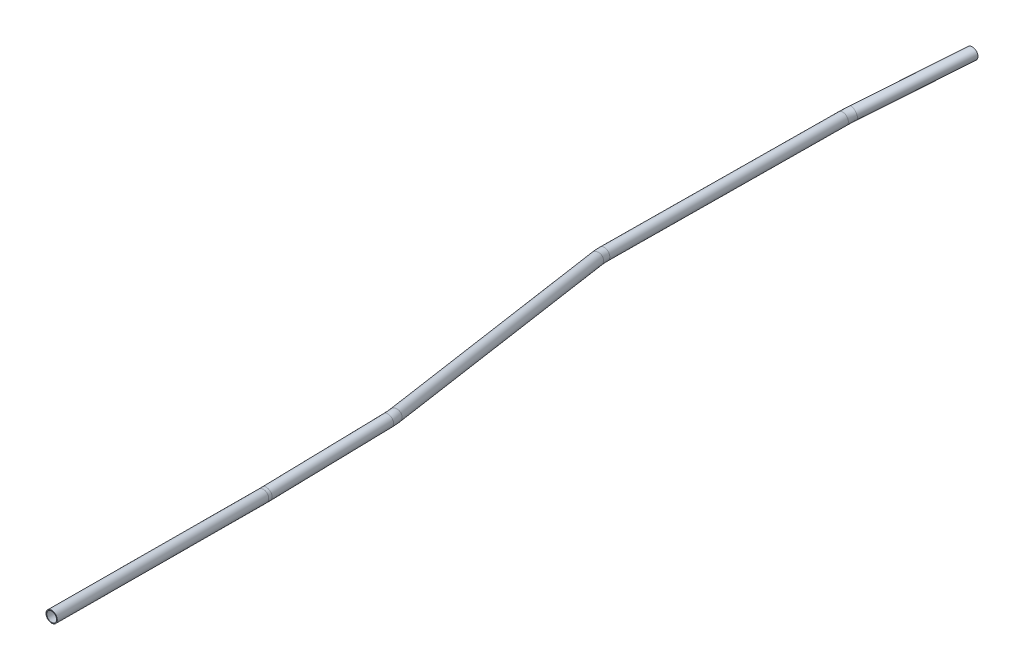
ISO-10303-21;
HEADER;
FILE_DESCRIPTION(('STEP AP214'),'2;1');
FILE_NAME('part.step','',(''),(''),'','','');
FILE_SCHEMA(('AUTOMOTIVE_DESIGN { 1 0 10303 214 1 1 1 1 }'));
ENDSEC;
DATA;
#1=APPLICATION_CONTEXT('core data for automotive mechanical design processes');
#2=APPLICATION_PROTOCOL_DEFINITION('international standard','automotive_design',2000,#1);
#3=PRODUCT_CONTEXT('',#1,'mechanical');
#4=PRODUCT('Part','Part','',(#3));
#5=PRODUCT_RELATED_PRODUCT_CATEGORY('part','',(#4));
#6=PRODUCT_DEFINITION_FORMATION('','',#4);
#7=PRODUCT_DEFINITION_CONTEXT('part definition',#1,'design');
#8=PRODUCT_DEFINITION('design','',#6,#7);
#9=PRODUCT_DEFINITION_SHAPE('','',#8);
#10=(LENGTH_UNIT() NAMED_UNIT(*) SI_UNIT(.MILLI.,.METRE.));
#11=(NAMED_UNIT(*) PLANE_ANGLE_UNIT() SI_UNIT($,.RADIAN.));
#12=(NAMED_UNIT(*) SI_UNIT($,.STERADIAN.) SOLID_ANGLE_UNIT());
#13=UNCERTAINTY_MEASURE_WITH_UNIT(LENGTH_MEASURE(1.E-05),#10,'distance_accuracy_value','');
#14=(GEOMETRIC_REPRESENTATION_CONTEXT(3) GLOBAL_UNCERTAINTY_ASSIGNED_CONTEXT((#13)) GLOBAL_UNIT_ASSIGNED_CONTEXT((#10,
#11,#12)) REPRESENTATION_CONTEXT('',''));
#15=CARTESIAN_POINT('',(0.,0.,0.));
#16=DIRECTION('',(0.,0.,1.));
#17=DIRECTION('',(1.,0.,0.));
#18=AXIS2_PLACEMENT_3D('',#15,#16,#17);
#19=CARTESIAN_POINT('',(-200.097461671091,113.749121177859,920.697327819594));
#20=DIRECTION('',(0.0609693238726773,0.0650491189961432,0.996017747665338));
#21=DIRECTION('',(0.,-0.997874152520213,0.0651703593059598));
#22=AXIS2_PLACEMENT_3D('',#19,#20,#21);
#23=CYLINDRICAL_SURFACE('',#22,11.049);
#24=CARTESIAN_POINT('',(-169.052406241001,146.871573201946,1427.861));
#25=DIRECTION('',(0.,0.,1.));
#26=DIRECTION('',(0.683856204975952,0.729616811015132,0.));
#27=AXIS2_PLACEMENT_3D('',#24,#25,#26);
#28=ELLIPSE('',#27,11.0931758253292,11.049);
#29=CARTESIAN_POINT('',(-161.466269119961,154.965340771653,1427.861));
#30=VERTEX_POINT('',#29);
#31=EDGE_CURVE('E47',#30,#30,#28,.T.);
#32=ORIENTED_EDGE('',*,*,#31,.T.);
#33=EDGE_LOOP('',(#32));
#34=FACE_BOUND('',#33,.T.);
#35=CARTESIAN_POINT('',(-200.097461671091,113.749121177859,920.697327819595));
#36=DIRECTION('',(0.0609693238726772,0.0650491189961432,0.996017747665339));
#37=DIRECTION('',(0.,-0.997874152520213,0.0651703593059598));
#38=AXIS2_PLACEMENT_3D('',#35,#36,#37);
#39=CIRCLE('',#38,11.049);
#40=CARTESIAN_POINT('',(-206.384831826603,104.715899165072,921.67214964704));
#41=VERTEX_POINT('',#40);
#42=EDGE_CURVE('E60',#41,#41,#39,.T.);
#43=ORIENTED_EDGE('',*,*,#42,.F.);
#44=EDGE_LOOP('',(#43));
#45=FACE_BOUND('',#44,.T.);
#46=ADVANCED_FACE('F43',(#34,#45),#23,.F.);
#47=CARTESIAN_POINT('',(-200.097461671091,113.749121177859,920.697327819594));
#48=DIRECTION('',(0.0609693238726773,0.0650491189961432,0.996017747665338));
#49=DIRECTION('',(0.,-0.997874152520213,0.0651703593059598));
#50=AXIS2_PLACEMENT_3D('',#47,#48,#49);
#51=CYLINDRICAL_SURFACE('',#50,12.7);
#52=CARTESIAN_POINT('',(-169.052406241001,146.871573201946,1427.861));
#53=DIRECTION('',(0.,0.,1.));
#54=DIRECTION('',(0.683856204975952,0.729616811015132,0.));
#55=AXIS2_PLACEMENT_3D('',#52,#53,#54);
#56=ELLIPSE('',#55,12.7507768107232,12.7);
#57=CARTESIAN_POINT('',(-160.332708400725,156.174754316552,1427.861));
#58=VERTEX_POINT('',#57);
#59=EDGE_CURVE('E52',#58,#58,#56,.T.);
#60=ORIENTED_EDGE('',*,*,#59,.F.);
#61=EDGE_LOOP('',(#60));
#62=FACE_BOUND('',#61,.T.);
#63=CARTESIAN_POINT('',(-200.097461671091,113.749121177859,920.697327819595));
#64=DIRECTION('',(-0.0609693238726772,-0.0650491189961432,-0.996017747665339));
#65=DIRECTION('',(0.,0.997874152520213,-0.0651703593059598));
#66=AXIS2_PLACEMENT_3D('',#63,#64,#65);
#67=CIRCLE('',#66,12.7);
#68=CARTESIAN_POINT('',(-207.324323918806,103.366107370057,921.817812678727));
#69=VERTEX_POINT('',#68);
#70=EDGE_CURVE('E10',#69,#69,#67,.T.);
#71=ORIENTED_EDGE('',*,*,#70,.F.);
#72=EDGE_LOOP('',(#71));
#73=FACE_BOUND('',#72,.T.);
#74=ADVANCED_FACE('F45',(#62,#73),#51,.T.);
#75=CARTESIAN_POINT('',(-171.45,131.826,1427.861));
#76=DIRECTION('',(0.,0.,1.));
#77=DIRECTION('',(1.,0.,0.));
#78=AXIS2_PLACEMENT_3D('',#75,#76,#77);
#79=PLANE('',#78);
#80=ORIENTED_EDGE('',*,*,#31,.F.);
#81=EDGE_LOOP('',(#80));
#82=FACE_BOUND('',#81,.T.);
#83=ORIENTED_EDGE('',*,*,#59,.T.);
#84=EDGE_LOOP('',(#83));
#85=FACE_BOUND('',#84,.T.);
#86=ADVANCED_FACE('F172',(#82,#85),#79,.T.);
#87=CARTESIAN_POINT('',(-155.579990225167,177.708486233918,913.795141087337));
#88=DIRECTION('',(0.820043510217331,-0.572157343537613,-0.0128302605749608));
#89=DIRECTION('',(0.572204442360909,0.820111014523303,0.));
#90=AXIS2_PLACEMENT_3D('',#87,#88,#89);
#91=TOROIDAL_SURFACE('',#90,78.2319999999991,11.049);
#92=CARTESIAN_POINT('',(-200.35188799348,113.578606447987,912.039717245192));
#93=DIRECTION('',(-0.00232098852145129,-0.0257434175814918,0.999665888916647));
#94=DIRECTION('',(0.,-0.999668581521458,-0.025743486921509));
#95=AXIS2_PLACEMENT_3D('',#92,#93,#94);
#96=CIRCLE('',#95,11.049);
#97=CARTESIAN_POINT('',(-206.675191736732,104.521301997701,911.79179212463));
#98=VERTEX_POINT('',#97);
#99=EDGE_CURVE('E65',#98,#98,#96,.T.);
#100=CARTESIAN_POINT('',(-155.579990225167,177.708486233918,913.795141087337));
#101=DIRECTION('',(0.820043510217331,-0.572157343537613,-0.0128302605749608));
#102=DIRECTION('',(0.572204442360909,0.820111014523303,0.));
#103=AXIS2_PLACEMENT_3D('',#100,#101,#102);
#104=CIRCLE('',#103,89.2809999999991);
#105=EDGE_CURVE('',#41,#98,#104,.T.);
#106=ORIENTED_EDGE('',*,*,#42,.T.);
#107=ORIENTED_EDGE('',*,*,#99,.F.);
#108=ORIENTED_EDGE('',*,*,#105,.T.);
#109=ORIENTED_EDGE('',*,*,#105,.F.);
#110=EDGE_LOOP('',(#106,#108,#107,#109));
#111=FACE_BOUND('',#110,.T.);
#112=ADVANCED_FACE('F169',(#111),#91,.F.);
#113=CARTESIAN_POINT('',(-155.579990225167,177.708486233918,913.795141087337));
#114=DIRECTION('',(0.820043510217331,-0.572157343537613,-0.0128302605749608));
#115=DIRECTION('',(0.572204442360909,0.820111014523303,0.));
#116=AXIS2_PLACEMENT_3D('',#113,#114,#115);
#117=TOROIDAL_SURFACE('',#116,78.2319999999991,12.7);
#118=CARTESIAN_POINT('',(-200.35188799348,113.578606447987,912.039717245192));
#119=DIRECTION('',(-0.00232098852145129,-0.0257434175814918,0.999665888916647));
#120=DIRECTION('',(0.,-0.999668581521458,-0.025743486921509));
#121=AXIS2_PLACEMENT_3D('',#118,#119,#120);
#122=CIRCLE('',#121,12.7);
#123=CARTESIAN_POINT('',(-207.620053215609,103.167911677544,911.754745842247));
#124=VERTEX_POINT('',#123);
#125=EDGE_CURVE('E64',#124,#124,#122,.T.);
#126=CARTESIAN_POINT('',(-155.579990225167,177.708486233918,913.795141087337));
#127=DIRECTION('',(0.820043510217331,-0.572157343537613,-0.0128302605749608));
#128=DIRECTION('',(0.572204442360909,0.820111014523303,0.));
#129=AXIS2_PLACEMENT_3D('',#126,#127,#128);
#130=CIRCLE('',#129,90.9319999999991);
#131=EDGE_CURVE('',#69,#124,#130,.T.);
#132=ORIENTED_EDGE('',*,*,#70,.T.);
#133=ORIENTED_EDGE('',*,*,#125,.T.);
#134=ORIENTED_EDGE('',*,*,#131,.T.);
#135=ORIENTED_EDGE('',*,*,#131,.F.);
#136=EDGE_LOOP('',(#132,#134,#133,#135));
#137=FACE_BOUND('',#136,.T.);
#138=ADVANCED_FACE('F165',(#137),#117,.T.);
#139=CARTESIAN_POINT('',(-199.717136613251,120.618998802645,638.64788575035));
#140=DIRECTION('',(-0.00232098852145166,-0.0257434175814926,0.999665888916647));
#141=DIRECTION('',(0.,-0.999668581521458,-0.0257434869215099));
#142=AXIS2_PLACEMENT_3D('',#139,#140,#141);
#143=CYLINDRICAL_SURFACE('',#142,11.049);
#144=CARTESIAN_POINT('',(-199.717136613251,120.618998802645,638.64788575035));
#145=DIRECTION('',(-0.00232098852145129,-0.0257434175814918,0.999665888916647));
#146=DIRECTION('',(0.,-0.999668581521458,-0.025743486921509));
#147=AXIS2_PLACEMENT_3D('',#144,#145,#146);
#148=CIRCLE('',#147,11.049);
#149=CARTESIAN_POINT('',(-189.809360472075,125.507168864739,638.796769531886));
#150=VERTEX_POINT('',#149);
#151=EDGE_CURVE('E88',#150,#150,#148,.T.);
#152=ORIENTED_EDGE('',*,*,#151,.F.);
#153=EDGE_LOOP('',(#152));
#154=FACE_BOUND('',#153,.T.);
#155=ORIENTED_EDGE('',*,*,#99,.T.);
#156=EDGE_LOOP('',(#155));
#157=FACE_BOUND('',#156,.T.);
#158=ADVANCED_FACE('F162',(#154,#157),#143,.F.);
#159=CARTESIAN_POINT('',(-199.717136613251,120.618998802645,638.64788575035));
#160=DIRECTION('',(-0.00232098852145166,-0.0257434175814926,0.999665888916647));
#161=DIRECTION('',(0.,-0.999668581521458,-0.0257434869215099));
#162=AXIS2_PLACEMENT_3D('',#159,#160,#161);
#163=CYLINDRICAL_SURFACE('',#162,12.7);
#164=CARTESIAN_POINT('',(-199.717136613251,120.618998802645,638.64788575035));
#165=DIRECTION('',(0.00232098852145129,0.0257434175814918,-0.999665888916647));
#166=DIRECTION('',(0.,0.999668581521458,0.025743486921509));
#167=AXIS2_PLACEMENT_3D('',#164,#165,#166);
#168=CIRCLE('',#167,12.7);
#169=CARTESIAN_POINT('',(-188.328888175118,126.237585080914,638.819016533725));
#170=VERTEX_POINT('',#169);
#171=EDGE_CURVE('E69',#170,#170,#168,.T.);
#172=ORIENTED_EDGE('',*,*,#171,.F.);
#173=EDGE_LOOP('',(#172));
#174=FACE_BOUND('',#173,.T.);
#175=ORIENTED_EDGE('',*,*,#125,.F.);
#176=EDGE_LOOP('',(#175));
#177=FACE_BOUND('',#176,.T.);
#178=ADVANCED_FACE('F152',(#174,#177),#163,.T.);
#179=CARTESIAN_POINT('',(-328.732320897393,71.6879890705573,38.4396950604482));
#180=DIRECTION('',(0.21271454878928,0.0810653161140893,0.973745826823764));
#181=DIRECTION('',(0.976961210122473,0.,-0.213416948521046));
#182=AXIS2_PLACEMENT_3D('',#179,#180,#181);
#183=CYLINDRICAL_SURFACE('',#182,11.049);
#184=CARTESIAN_POINT('',(-328.732320897386,71.6879890705599,38.4396950604789));
#185=DIRECTION('',(0.212714548789278,0.0810653161140891,0.973745826823765));
#186=DIRECTION('',(0.976961210122474,0.,-0.213416948521044));
#187=AXIS2_PLACEMENT_3D('',#184,#185,#186);
#188=CIRCLE('',#187,11.049);
#189=CARTESIAN_POINT('',(-338.842563257646,68.0084958401719,40.9545966458976));
#190=VERTEX_POINT('',#189);
#191=EDGE_CURVE('E92',#190,#190,#188,.T.);
#192=ORIENTED_EDGE('',*,*,#191,.F.);
#193=EDGE_LOOP('',(#192));
#194=FACE_BOUND('',#193,.T.);
#195=CARTESIAN_POINT('',(-201.719236998212,120.092556861133,619.868944271621));
#196=DIRECTION('',(-0.212714548789278,-0.0810653161140893,-0.973745826823764));
#197=DIRECTION('',(-0.976961210122473,0.,0.213416948521044));
#198=AXIS2_PLACEMENT_3D('',#195,#196,#197);
#199=CIRCLE('',#198,11.049);
#200=CARTESIAN_POINT('',(-192.094225034783,124.906375545124,617.365607422233));
#201=VERTEX_POINT('',#200);
#202=EDGE_CURVE('E84',#201,#201,#199,.T.);
#203=ORIENTED_EDGE('',*,*,#202,.F.);
#204=EDGE_LOOP('',(#203));
#205=FACE_BOUND('',#204,.T.);
#206=ADVANCED_FACE('F148',(#194,#205),#183,.F.);
#207=CARTESIAN_POINT('',(-328.732320897393,71.6879890705573,38.4396950604482));
#208=DIRECTION('',(0.21271454878928,0.0810653161140893,0.973745826823764));
#209=DIRECTION('',(0.976961210122473,0.,-0.213416948521046));
#210=AXIS2_PLACEMENT_3D('',#207,#208,#209);
#211=CYLINDRICAL_SURFACE('',#210,12.7);
#212=CARTESIAN_POINT('',(-328.732320897393,71.6879890705574,38.4396950604495));
#213=DIRECTION('',(-0.212714548789278,-0.0810653161140891,-0.973745826823765));
#214=DIRECTION('',(-0.976961210122474,0.,0.213416948521044));
#215=AXIS2_PLACEMENT_3D('',#212,#213,#214);
#216=CIRCLE('',#215,12.7);
#217=CARTESIAN_POINT('',(-340.353289127577,67.4586865068927,41.3303865379374));
#218=VERTEX_POINT('',#217);
#219=EDGE_CURVE('E80',#218,#218,#216,.T.);
#220=ORIENTED_EDGE('',*,*,#219,.F.);
#221=EDGE_LOOP('',(#220));
#222=FACE_BOUND('',#221,.T.);
#223=CARTESIAN_POINT('',(-201.719236998212,120.092556861133,619.868944271622));
#224=DIRECTION('',(0.212714548789278,0.0810653161140891,0.973745826823765));
#225=DIRECTION('',(0.976961210122474,0.,-0.213416948521044));
#226=AXIS2_PLACEMENT_3D('',#223,#224,#225);
#227=CIRCLE('',#226,12.7);
#228=CARTESIAN_POINT('',(-190.656004856339,125.625681785261,616.991545594164));
#229=VERTEX_POINT('',#228);
#230=EDGE_CURVE('E70',#229,#229,#227,.T.);
#231=ORIENTED_EDGE('',*,*,#230,.F.);
#232=EDGE_LOOP('',(#231));
#233=FACE_BOUND('',#232,.T.);
#234=ADVANCED_FACE('F151',(#222,#233),#211,.T.);
#235=CARTESIAN_POINT('',(-269.868746992148,86.0085073285092,637.593720124761));
#236=DIRECTION('',(-0.44260744390062,0.896444148873496,0.0220576189611005));
#237=DIRECTION('',(-0.896662305803114,-0.442715155999705,0.));
#238=AXIS2_PLACEMENT_3D('',#235,#236,#237);
#239=TOROIDAL_SURFACE('',#238,78.2320000000001,11.049);
#240=CARTESIAN_POINT('',(-269.868746992148,86.0085073285092,637.593720124761));
#241=DIRECTION('',(-0.44260744390062,0.896444148873496,0.0220576189611005));
#242=DIRECTION('',(-0.896662305803114,-0.442715155999705,0.));
#243=AXIS2_PLACEMENT_3D('',#240,#241,#242);
#244=CIRCLE('',#243,89.2810000000001);
#245=EDGE_CURVE('',#150,#201,#244,.T.);
#246=ORIENTED_EDGE('',*,*,#151,.T.);
#247=ORIENTED_EDGE('',*,*,#202,.T.);
#248=ORIENTED_EDGE('',*,*,#245,.T.);
#249=ORIENTED_EDGE('',*,*,#245,.F.);
#250=EDGE_LOOP('',(#246,#248,#247,#249));
#251=FACE_BOUND('',#250,.T.);
#252=ADVANCED_FACE('F156',(#251),#239,.F.);
#253=CARTESIAN_POINT('',(-269.868746992148,86.0085073285092,637.593720124761));
#254=DIRECTION('',(-0.44260744390062,0.896444148873496,0.0220576189611005));
#255=DIRECTION('',(-0.896662305803114,-0.442715155999705,0.));
#256=AXIS2_PLACEMENT_3D('',#253,#254,#255);
#257=TOROIDAL_SURFACE('',#256,78.2320000000001,12.7);
#258=CARTESIAN_POINT('',(-269.868746992148,86.0085073285092,637.593720124761));
#259=DIRECTION('',(-0.44260744390062,0.896444148873496,0.0220576189611005));
#260=DIRECTION('',(-0.896662305803114,-0.442715155999705,0.));
#261=AXIS2_PLACEMENT_3D('',#258,#259,#260);
#262=CIRCLE('',#261,90.9320000000001);
#263=EDGE_CURVE('',#170,#229,#262,.T.);
#264=ORIENTED_EDGE('',*,*,#171,.T.);
#265=ORIENTED_EDGE('',*,*,#230,.T.);
#266=ORIENTED_EDGE('',*,*,#263,.T.);
#267=ORIENTED_EDGE('',*,*,#263,.F.);
#268=EDGE_LOOP('',(#264,#266,#265,#267));
#269=FACE_BOUND('',#268,.T.);
#270=ADVANCED_FACE('F144',(#269),#257,.T.);
#271=CARTESIAN_POINT('',(-257.147156599456,97.7404928627321,20.6330355591237));
#272=DIRECTION('',(0.342724451980664,-0.93943003552099,0.00334041548097702));
#273=DIRECTION('',(0.93943527682144,0.342726364120745,0.));
#274=AXIS2_PLACEMENT_3D('',#271,#272,#273);
#275=TOROIDAL_SURFACE('',#274,78.2319999999999,11.049);
#276=CARTESIAN_POINT('',(-330.638019560969,70.9272193840803,20.0107409896593));
#277=DIRECTION('',(-0.00861756932319646,0.000411780998432308,0.999962783275143));
#278=DIRECTION('',(0.999962868053794,0.,0.00861757005380942));
#279=AXIS2_PLACEMENT_3D('',#276,#277,#278);
#280=CIRCLE('',#279,11.049);
#281=CARTESIAN_POINT('',(-341.017410920793,67.1402797856344,19.9228519839071));
#282=VERTEX_POINT('',#281);
#283=EDGE_CURVE('E97',#282,#282,#280,.T.);
#284=CARTESIAN_POINT('',(-257.147156599456,97.7404928627321,20.6330355591237));
#285=DIRECTION('',(0.342724451980664,-0.93943003552099,0.00334041548097702));
#286=DIRECTION('',(0.93943527682144,0.342726364120745,0.));
#287=AXIS2_PLACEMENT_3D('',#284,#285,#286);
#288=CIRCLE('',#287,89.2809999999999);
#289=EDGE_CURVE('',#190,#282,#288,.T.);
#290=ORIENTED_EDGE('',*,*,#191,.T.);
#291=ORIENTED_EDGE('',*,*,#283,.F.);
#292=ORIENTED_EDGE('',*,*,#289,.T.);
#293=ORIENTED_EDGE('',*,*,#289,.F.);
#294=EDGE_LOOP('',(#290,#292,#291,#293));
#295=FACE_BOUND('',#294,.T.);
#296=ADVANCED_FACE('F141',(#295),#275,.F.);
#297=CARTESIAN_POINT('',(-257.147156599456,97.7404928627321,20.6330355591237));
#298=DIRECTION('',(0.342724451980664,-0.93943003552099,0.00334041548097702));
#299=DIRECTION('',(0.93943527682144,0.342726364120745,0.));
#300=AXIS2_PLACEMENT_3D('',#297,#298,#299);
#301=TOROIDAL_SURFACE('',#300,78.2319999999999,12.7);
#302=CARTESIAN_POINT('',(-330.638019560969,70.9272193840803,20.0107409896593));
#303=DIRECTION('',(-0.00861756932319646,0.000411780998432308,0.999962783275143));
#304=DIRECTION('',(0.999962868053794,0.,0.00861757005380942));
#305=AXIS2_PLACEMENT_3D('',#302,#303,#304);
#306=CIRCLE('',#305,12.7);
#307=CARTESIAN_POINT('',(-342.568354457318,66.5744152479355,19.9097191439671));
#308=VERTEX_POINT('',#307);
#309=EDGE_CURVE('E96',#308,#308,#306,.T.);
#310=CARTESIAN_POINT('',(-257.147156599456,97.7404928627321,20.6330355591237));
#311=DIRECTION('',(0.342724451980664,-0.93943003552099,0.00334041548097702));
#312=DIRECTION('',(0.93943527682144,0.342726364120745,0.));
#313=AXIS2_PLACEMENT_3D('',#310,#311,#312);
#314=CIRCLE('',#313,90.9319999999999);
#315=EDGE_CURVE('',#218,#308,#314,.T.);
#316=ORIENTED_EDGE('',*,*,#219,.T.);
#317=ORIENTED_EDGE('',*,*,#309,.T.);
#318=ORIENTED_EDGE('',*,*,#315,.T.);
#319=ORIENTED_EDGE('',*,*,#315,.F.);
#320=EDGE_LOOP('',(#316,#318,#317,#319));
#321=FACE_BOUND('',#320,.T.);
#322=ADVANCED_FACE('F137',(#321),#301,.T.);
#323=CARTESIAN_POINT('',(-326.042536736013,70.7076293309975,-513.238441419259));
#324=DIRECTION('',(-0.0086175693235513,0.000411780998272257,0.999962783275139));
#325=DIRECTION('',(0.999962868053791,0.,0.00861757005416428));
#326=AXIS2_PLACEMENT_3D('',#323,#324,#325);
#327=CYLINDRICAL_SURFACE('',#326,11.049);
#328=CARTESIAN_POINT('',(-326.042536736013,70.7076293309975,-513.238441419228));
#329=DIRECTION('',(-0.00861756932319646,0.000411780998432308,0.999962783275143));
#330=DIRECTION('',(0.999962868053794,0.,0.00861757005380942));
#331=AXIS2_PLACEMENT_3D('',#328,#329,#330);
#332=CIRCLE('',#331,11.049);
#333=CARTESIAN_POINT('',(-335.142372679295,64.4412400228081,-513.314282328804));
#334=VERTEX_POINT('',#333);
#335=EDGE_CURVE('E124',#334,#334,#332,.T.);
#336=ORIENTED_EDGE('',*,*,#335,.F.);
#337=EDGE_LOOP('',(#336));
#338=FACE_BOUND('',#337,.T.);
#339=ORIENTED_EDGE('',*,*,#283,.T.);
#340=EDGE_LOOP('',(#339));
#341=FACE_BOUND('',#340,.T.);
#342=ADVANCED_FACE('F133',(#338,#341),#327,.F.);
#343=CARTESIAN_POINT('',(-326.042536736013,70.7076293309975,-513.238441419259));
#344=DIRECTION('',(-0.0086175693235513,0.000411780998272257,0.999962783275139));
#345=DIRECTION('',(0.999962868053791,0.,0.00861757005416428));
#346=AXIS2_PLACEMENT_3D('',#343,#344,#345);
#347=CYLINDRICAL_SURFACE('',#346,12.7);
#348=CARTESIAN_POINT('',(-326.042536736013,70.7076293309975,-513.238441419258));
#349=DIRECTION('',(0.00861756932319646,-0.000411780998432308,-0.999962783275143));
#350=DIRECTION('',(-0.999962868053794,0.,-0.00861757005380942));
#351=AXIS2_PLACEMENT_3D('',#348,#349,#350);
#352=CIRCLE('',#351,12.7);
#353=CARTESIAN_POINT('',(-336.502118280015,63.5048829997454,-513.325614878545));
#354=VERTEX_POINT('',#353);
#355=EDGE_CURVE('E101',#354,#354,#352,.T.);
#356=ORIENTED_EDGE('',*,*,#355,.F.);
#357=EDGE_LOOP('',(#356));
#358=FACE_BOUND('',#357,.T.);
#359=ORIENTED_EDGE('',*,*,#309,.F.);
#360=EDGE_LOOP('',(#359));
#361=FACE_BOUND('',#360,.T.);
#362=ADVANCED_FACE('F136',(#358,#361),#347,.T.);
#363=CARTESIAN_POINT('',(-268.329604576392,108.860777143036,-763.238321143162));
#364=DIRECTION('',(-0.231419568546329,-0.153252933367984,0.960707302828463));
#365=DIRECTION('',(0.972191808874912,0.,0.234186008882956));
#366=AXIS2_PLACEMENT_3D('',#363,#364,#365);
#367=CYLINDRICAL_SURFACE('',#366,11.049);
#368=CARTESIAN_POINT('',(-271.388838655165,106.834861187111,-750.53832114316));
#369=DIRECTION('',(0.,0.,1.));
#370=DIRECTION('',(-0.833753702996067,-0.5521365435654,0.));
#371=AXIS2_PLACEMENT_3D('',#368,#369,#370);
#372=ELLIPSE('',#371,11.5009014373786,11.049);
#373=CARTESIAN_POINT('',(-280.977757816372,100.484793219591,-750.53832114316));
#374=VERTEX_POINT('',#373);
#375=EDGE_CURVE('E109',#374,#374,#372,.T.);
#376=ORIENTED_EDGE('',*,*,#375,.F.);
#377=EDGE_LOOP('',(#376));
#378=FACE_BOUND('',#377,.T.);
#379=CARTESIAN_POINT('',(-323.450347171268,72.3581790907233,-534.411950577945));
#380=DIRECTION('',(0.231419568545988,0.153252933367833,-0.960707302828569));
#381=DIRECTION('',(-0.972191808874997,0.,-0.234186008882605));
#382=AXIS2_PLACEMENT_3D('',#379,#380,#381);
#383=CIRCLE('',#382,11.049);
#384=CARTESIAN_POINT('',(-332.184078462962,66.3249031138005,-537.478205575621));
#385=VERTEX_POINT('',#384);
#386=EDGE_CURVE('E117',#385,#385,#383,.T.);
#387=ORIENTED_EDGE('',*,*,#386,.F.);
#388=EDGE_LOOP('',(#387));
#389=FACE_BOUND('',#388,.T.);
#390=ADVANCED_FACE('F203',(#378,#389),#367,.F.);
#391=CARTESIAN_POINT('',(-268.329604576392,108.860777143036,-763.238321143162));
#392=DIRECTION('',(-0.231419568546329,-0.153252933367984,0.960707302828463));
#393=DIRECTION('',(0.972191808874912,0.,0.234186008882956));
#394=AXIS2_PLACEMENT_3D('',#391,#392,#393);
#395=CYLINDRICAL_SURFACE('',#394,12.7);
#396=CARTESIAN_POINT('',(-271.388838655165,106.834861187111,-750.53832114316));
#397=DIRECTION('',(0.,0.,1.));
#398=DIRECTION('',(-0.833753702996067,-0.5521365435654,0.));
#399=AXIS2_PLACEMENT_3D('',#396,#397,#398);
#400=ELLIPSE('',#399,13.2194269395156,12.7);
#401=CARTESIAN_POINT('',(-282.410584817472,99.5359324888117,-750.53832114316));
#402=VERTEX_POINT('',#401);
#403=EDGE_CURVE('E113',#402,#402,#400,.T.);
#404=ORIENTED_EDGE('',*,*,#403,.T.);
#405=EDGE_LOOP('',(#404));
#406=FACE_BOUND('',#405,.T.);
#407=CARTESIAN_POINT('',(-323.450347171261,72.3581790907279,-534.411950577974));
#408=DIRECTION('',(-0.231419568545988,-0.153252933367833,0.960707302828569));
#409=DIRECTION('',(0.972191808874997,0.,0.234186008882605));
#410=AXIS2_PLACEMENT_3D('',#407,#408,#409);
#411=CIRCLE('',#410,12.7);
#412=CARTESIAN_POINT('',(-333.489118770908,65.4233791172544,-537.93638160979));
#413=VERTEX_POINT('',#412);
#414=EDGE_CURVE('E102',#413,#413,#411,.T.);
#415=ORIENTED_EDGE('',*,*,#414,.F.);
#416=EDGE_LOOP('',(#415));
#417=FACE_BOUND('',#416,.T.);
#418=ADVANCED_FACE('F206',(#406,#417),#395,.T.);
#419=CARTESIAN_POINT('',(1.11022302462516E-13,0.,-750.538321143161));
#420=DIRECTION('',(0.,0.,1.));
#421=DIRECTION('',(1.,0.,0.));
#422=AXIS2_PLACEMENT_3D('',#419,#420,#421);
#423=PLANE('',#422);
#424=ORIENTED_EDGE('',*,*,#375,.T.);
#425=EDGE_LOOP('',(#424));
#426=FACE_BOUND('',#425,.T.);
#427=ORIENTED_EDGE('',*,*,#403,.F.);
#428=EDGE_LOOP('',(#427));
#429=FACE_BOUND('',#428,.T.);
#430=ADVANCED_FACE('F209',(#426,#429),#423,.F.);
#431=CARTESIAN_POINT('',(-261.611506781127,115.076551995258,-512.701452846345));
#432=DIRECTION('',(0.567121446633834,-0.823617598107257,0.00522655297316755));
#433=DIRECTION('',(0.82362884765939,0.567129192779976,0.));
#434=AXIS2_PLACEMENT_3D('',#431,#432,#433);
#435=TOROIDAL_SURFACE('',#434,78.2320092811249,11.049);
#436=CARTESIAN_POINT('',(-261.611506781127,115.076551995258,-512.701452846345));
#437=DIRECTION('',(0.567121446633834,-0.823617598107257,0.00522655297316755));
#438=DIRECTION('',(0.82362884765939,0.567129192779976,0.));
#439=AXIS2_PLACEMENT_3D('',#436,#437,#438);
#440=CIRCLE('',#439,89.2810092811249);
#441=EDGE_CURVE('',#334,#385,#440,.T.);
#442=ORIENTED_EDGE('',*,*,#335,.T.);
#443=ORIENTED_EDGE('',*,*,#386,.T.);
#444=ORIENTED_EDGE('',*,*,#441,.T.);
#445=ORIENTED_EDGE('',*,*,#441,.F.);
#446=EDGE_LOOP('',(#442,#444,#443,#445));
#447=FACE_BOUND('',#446,.T.);
#448=ADVANCED_FACE('F131',(#447),#435,.F.);
#449=CARTESIAN_POINT('',(-261.611506781127,115.076551995258,-512.701452846345));
#450=DIRECTION('',(0.567121446633834,-0.823617598107257,0.00522655297316755));
#451=DIRECTION('',(0.82362884765939,0.567129192779976,0.));
#452=AXIS2_PLACEMENT_3D('',#449,#450,#451);
#453=TOROIDAL_SURFACE('',#452,78.2320092811249,12.7);
#454=CARTESIAN_POINT('',(-261.611506781127,115.076551995258,-512.701452846345));
#455=DIRECTION('',(0.567121446633834,-0.823617598107257,0.00522655297316755));
#456=DIRECTION('',(0.82362884765939,0.567129192779976,0.));
#457=AXIS2_PLACEMENT_3D('',#454,#455,#456);
#458=CIRCLE('',#457,90.9320092811249);
#459=EDGE_CURVE('',#354,#413,#458,.T.);
#460=ORIENTED_EDGE('',*,*,#355,.T.);
#461=ORIENTED_EDGE('',*,*,#414,.T.);
#462=ORIENTED_EDGE('',*,*,#459,.T.);
#463=ORIENTED_EDGE('',*,*,#459,.F.);
#464=EDGE_LOOP('',(#460,#462,#461,#463));
#465=FACE_BOUND('',#464,.T.);
#466=ADVANCED_FACE('F219',(#465),#453,.T.);
#467=CLOSED_SHELL('',(#46,#74,#86,#112,#138,#158,#178,#206,#234,#252,#270,#296,#322,#342,#362,
#390,#418,#430,#448,#466));
#468=MANIFOLD_SOLID_BREP('B2',#467);
#469=ADVANCED_BREP_SHAPE_REPRESENTATION('',(#18,#468),#14);
#470=SHAPE_DEFINITION_REPRESENTATION(#9,#469);
ENDSEC;
END-ISO-10303-21;
